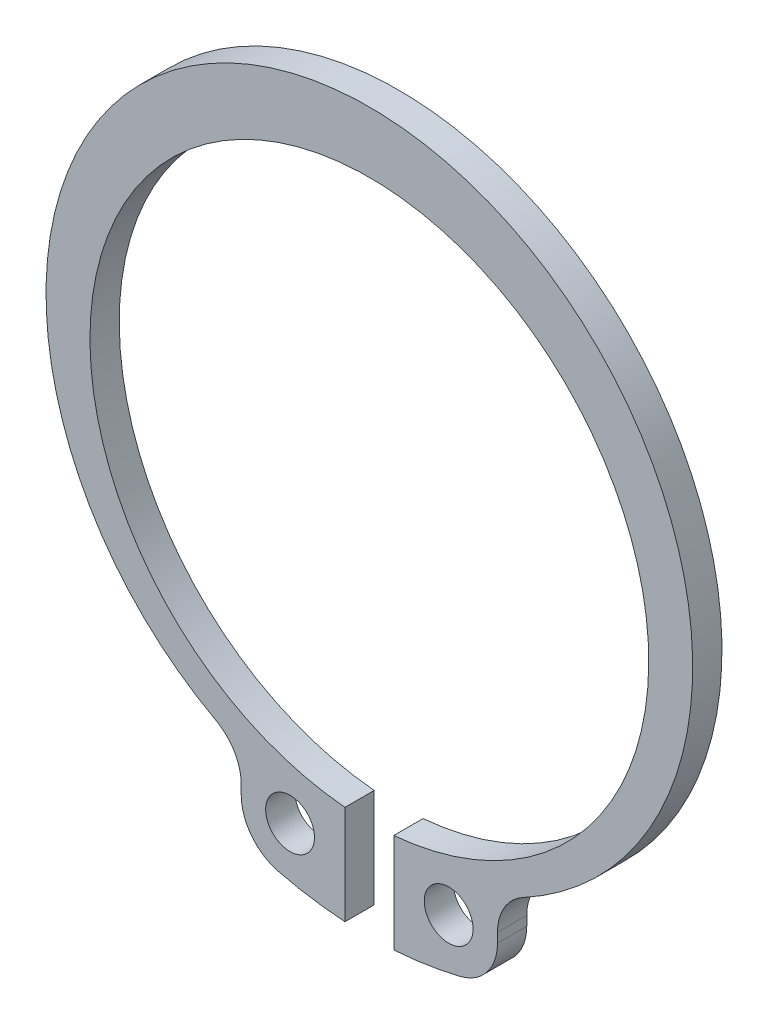
ISO-10303-21;
HEADER;
FILE_DESCRIPTION(('STEP AP214'),'2;1');
FILE_NAME('part.step','',(''),(''),'','','');
FILE_SCHEMA(('AUTOMOTIVE_DESIGN { 1 0 10303 214 1 1 1 1 }'));
ENDSEC;
DATA;
#1=APPLICATION_CONTEXT('core data for automotive mechanical design processes');
#2=APPLICATION_PROTOCOL_DEFINITION('international standard','automotive_design',2000,#1);
#3=PRODUCT_CONTEXT('',#1,'mechanical');
#4=PRODUCT('Part','Part','',(#3));
#5=PRODUCT_RELATED_PRODUCT_CATEGORY('part','',(#4));
#6=PRODUCT_DEFINITION_FORMATION('','',#4);
#7=PRODUCT_DEFINITION_CONTEXT('part definition',#1,'design');
#8=PRODUCT_DEFINITION('design','',#6,#7);
#9=PRODUCT_DEFINITION_SHAPE('','',#8);
#10=(LENGTH_UNIT() NAMED_UNIT(*) SI_UNIT(.MILLI.,.METRE.));
#11=(NAMED_UNIT(*) PLANE_ANGLE_UNIT() SI_UNIT($,.RADIAN.));
#12=(NAMED_UNIT(*) SI_UNIT($,.STERADIAN.) SOLID_ANGLE_UNIT());
#13=UNCERTAINTY_MEASURE_WITH_UNIT(LENGTH_MEASURE(1.E-05),#10,'distance_accuracy_value','');
#14=(GEOMETRIC_REPRESENTATION_CONTEXT(3) GLOBAL_UNCERTAINTY_ASSIGNED_CONTEXT((#13)) GLOBAL_UNIT_ASSIGNED_CONTEXT((#10,
#11,#12)) REPRESENTATION_CONTEXT('',''));
#15=CARTESIAN_POINT('',(0.,0.,0.));
#16=DIRECTION('',(0.,0.,1.));
#17=DIRECTION('',(1.,0.,0.));
#18=AXIS2_PLACEMENT_3D('',#15,#16,#17);
#19=CARTESIAN_POINT('',(3.25,-13.1029576813786,1.2));
#20=DIRECTION('',(0.,0.,1.));
#21=DIRECTION('',(1.,0.,0.));
#22=AXIS2_PLACEMENT_3D('',#19,#20,#21);
#23=PLANE('',#22);
#24=CARTESIAN_POINT('',(3.25,-13.1029576813786,1.2));
#25=DIRECTION('',(0.,0.,1.));
#26=DIRECTION('',(1.,0.,0.));
#27=AXIS2_PLACEMENT_3D('',#24,#25,#26);
#28=CIRCLE('',#27,1.);
#29=CARTESIAN_POINT('',(4.25,-13.1029576813786,1.2));
#30=VERTEX_POINT('',#29);
#31=EDGE_CURVE('E136',#30,#30,#28,.T.);
#32=ORIENTED_EDGE('',*,*,#31,.F.);
#33=EDGE_LOOP('',(#32));
#34=FACE_BOUND('',#33,.T.);
#35=CARTESIAN_POINT('',(3.25,-13.1029576813786,1.2));
#36=DIRECTION('',(0.,0.,1.));
#37=DIRECTION('',(1.,0.,0.));
#38=AXIS2_PLACEMENT_3D('',#35,#36,#37);
#39=CIRCLE('',#38,2.);
#40=CARTESIAN_POINT('',(3.73148148148147,-15.0441365971383,1.2));
#41=VERTEX_POINT('',#40);
#42=CARTESIAN_POINT('',(5.25,-13.1029576813785,1.2));
#43=VERTEX_POINT('',#42);
#44=EDGE_CURVE('E170',#41,#43,#39,.T.);
#45=ORIENTED_EDGE('',*,*,#44,.T.);
#46=DIRECTION('',(0.,-1.,0.));
#47=VECTOR('',#46,1.);
#48=CARTESIAN_POINT('',(5.25,-12.7164078649986,1.2));
#49=LINE('',#48,#47);
#50=CARTESIAN_POINT('',(5.25,-12.7164078649986,1.2));
#51=VERTEX_POINT('',#50);
#52=EDGE_CURVE('E127',#51,#43,#49,.T.);
#53=ORIENTED_EDGE('',*,*,#52,.F.);
#54=CARTESIAN_POINT('',(7.25000000000001,-12.7164078649987,1.2));
#55=DIRECTION('',(0.,0.,1.));
#56=DIRECTION('',(1.,0.,0.));
#57=AXIS2_PLACEMENT_3D('',#54,#55,#56);
#58=CIRCLE('',#57,2.);
#59=CARTESIAN_POINT('',(6.29918032786886,-10.956878964671,1.2));
#60=VERTEX_POINT('',#59);
#61=EDGE_CURVE('E173',#60,#51,#58,.T.);
#62=ORIENTED_EDGE('',*,*,#61,.F.);
#63=CARTESIAN_POINT('',(0.,0.699999999999978,1.2));
#64=DIRECTION('',(0.,0.,1.));
#65=DIRECTION('',(1.,0.,0.));
#66=AXIS2_PLACEMENT_3D('',#63,#64,#65);
#67=CIRCLE('',#66,13.25);
#68=CARTESIAN_POINT('',(-6.29918032786884,-10.9568789646708,1.2));
#69=VERTEX_POINT('',#68);
#70=EDGE_CURVE('E176',#60,#69,#67,.T.);
#71=ORIENTED_EDGE('',*,*,#70,.T.);
#72=CARTESIAN_POINT('',(-7.24999999999999,-12.7164078649986,1.2));
#73=DIRECTION('',(0.,0.,-1.));
#74=DIRECTION('',(-1.,0.,0.));
#75=AXIS2_PLACEMENT_3D('',#72,#73,#74);
#76=CIRCLE('',#75,2.);
#77=CARTESIAN_POINT('',(-5.24999999999999,-12.7164078649987,1.2));
#78=VERTEX_POINT('',#77);
#79=EDGE_CURVE('E178',#69,#78,#76,.T.);
#80=ORIENTED_EDGE('',*,*,#79,.T.);
#81=DIRECTION('',(0.,-1.,0.));
#82=VECTOR('',#81,1.);
#83=CARTESIAN_POINT('',(-5.24999999999999,-12.7164078649987,1.2));
#84=LINE('',#83,#82);
#85=CARTESIAN_POINT('',(-5.24999999999999,-13.1029576813786,1.2));
#86=VERTEX_POINT('',#85);
#87=EDGE_CURVE('E180',#78,#86,#84,.T.);
#88=ORIENTED_EDGE('',*,*,#87,.T.);
#89=CARTESIAN_POINT('',(-3.25,-13.1029576813785,1.2));
#90=DIRECTION('',(0.,0.,-1.));
#91=DIRECTION('',(-1.,0.,0.));
#92=AXIS2_PLACEMENT_3D('',#89,#90,#91);
#93=CIRCLE('',#92,2.);
#94=CARTESIAN_POINT('',(-3.73148148148149,-15.0441365971384,1.2));
#95=VERTEX_POINT('',#94);
#96=EDGE_CURVE('E182',#95,#86,#93,.T.);
#97=ORIENTED_EDGE('',*,*,#96,.F.);
#98=CARTESIAN_POINT('',(0.,0.,1.2));
#99=DIRECTION('',(0.,0.,1.));
#100=DIRECTION('',(1.,0.,0.));
#101=AXIS2_PLACEMENT_3D('',#98,#99,#100);
#102=CIRCLE('',#101,15.5);
#103=CARTESIAN_POINT('',(-1.,-15.4677082982579,1.2));
#104=VERTEX_POINT('',#103);
#105=EDGE_CURVE('E185',#95,#104,#102,.T.);
#106=ORIENTED_EDGE('',*,*,#105,.T.);
#107=DIRECTION('',(0.,-1.,0.));
#108=VECTOR('',#107,1.);
#109=CARTESIAN_POINT('',(-1.,-11.4062482876709,1.2));
#110=LINE('',#109,#108);
#111=CARTESIAN_POINT('',(-0.999999999999987,-11.4062482876709,1.2));
#112=VERTEX_POINT('',#111);
#113=EDGE_CURVE('E187',#112,#104,#110,.T.);
#114=ORIENTED_EDGE('',*,*,#113,.F.);
#115=CARTESIAN_POINT('',(0.,0.,1.2));
#116=DIRECTION('',(0.,0.,1.));
#117=DIRECTION('',(1.,0.,0.));
#118=AXIS2_PLACEMENT_3D('',#115,#116,#117);
#119=CIRCLE('',#118,11.45);
#120=CARTESIAN_POINT('',(1.,-11.4062482876711,1.2));
#121=VERTEX_POINT('',#120);
#122=EDGE_CURVE('E190',#121,#112,#119,.T.);
#123=ORIENTED_EDGE('',*,*,#122,.F.);
#124=DIRECTION('',(0.,-1.,0.));
#125=VECTOR('',#124,1.);
#126=CARTESIAN_POINT('',(1.,-11.4062482876711,1.2));
#127=LINE('',#126,#125);
#128=CARTESIAN_POINT('',(1.,-15.467708298258,1.2));
#129=VERTEX_POINT('',#128);
#130=EDGE_CURVE('E52',#121,#129,#127,.T.);
#131=ORIENTED_EDGE('',*,*,#130,.T.);
#132=CARTESIAN_POINT('',(0.,0.,1.2));
#133=DIRECTION('',(0.,0.,1.));
#134=DIRECTION('',(1.,0.,0.));
#135=AXIS2_PLACEMENT_3D('',#132,#133,#134);
#136=CIRCLE('',#135,15.5);
#137=EDGE_CURVE('E47',#129,#41,#136,.T.);
#138=ORIENTED_EDGE('',*,*,#137,.T.);
#139=EDGE_LOOP('',(#45,#53,#62,#71,#80,#88,#97,#106,#114,#123,#131,#138));
#140=FACE_BOUND('',#139,.T.);
#141=CARTESIAN_POINT('',(-3.25,-13.1029576813785,1.2));
#142=DIRECTION('',(0.,0.,1.));
#143=DIRECTION('',(1.,0.,0.));
#144=AXIS2_PLACEMENT_3D('',#141,#142,#143);
#145=CIRCLE('',#144,1.);
#146=CARTESIAN_POINT('',(-2.25,-13.1029576813785,1.2));
#147=VERTEX_POINT('',#146);
#148=EDGE_CURVE('E283',#147,#147,#145,.T.);
#149=ORIENTED_EDGE('',*,*,#148,.F.);
#150=EDGE_LOOP('',(#149));
#151=FACE_BOUND('',#150,.T.);
#152=ADVANCED_FACE('F32',(#34,#140,#151),#23,.T.);
#153=CARTESIAN_POINT('',(3.25,-13.1029576813786,0.));
#154=DIRECTION('',(0.,0.,1.));
#155=DIRECTION('',(1.,0.,0.));
#156=AXIS2_PLACEMENT_3D('',#153,#154,#155);
#157=PLANE('',#156);
#158=CARTESIAN_POINT('',(3.25,-13.1029576813786,0.));
#159=DIRECTION('',(0.,0.,1.));
#160=DIRECTION('',(1.,0.,0.));
#161=AXIS2_PLACEMENT_3D('',#158,#159,#160);
#162=CIRCLE('',#161,1.);
#163=CARTESIAN_POINT('',(4.25,-13.1029576813786,0.));
#164=VERTEX_POINT('',#163);
#165=EDGE_CURVE('E288',#164,#164,#162,.T.);
#166=ORIENTED_EDGE('',*,*,#165,.T.);
#167=EDGE_LOOP('',(#166));
#168=FACE_BOUND('',#167,.T.);
#169=CARTESIAN_POINT('',(3.25,-13.1029576813786,0.));
#170=DIRECTION('',(0.,0.,1.));
#171=DIRECTION('',(1.,0.,0.));
#172=AXIS2_PLACEMENT_3D('',#169,#170,#171);
#173=CIRCLE('',#172,2.);
#174=CARTESIAN_POINT('',(3.73148148148147,-15.0441365971383,0.));
#175=VERTEX_POINT('',#174);
#176=CARTESIAN_POINT('',(5.25,-13.1029576813785,0.));
#177=VERTEX_POINT('',#176);
#178=EDGE_CURVE('E132',#175,#177,#173,.T.);
#179=ORIENTED_EDGE('',*,*,#178,.F.);
#180=CARTESIAN_POINT('',(0.,0.,0.));
#181=DIRECTION('',(0.,0.,1.));
#182=DIRECTION('',(1.,0.,0.));
#183=AXIS2_PLACEMENT_3D('',#180,#181,#182);
#184=CIRCLE('',#183,15.5);
#185=CARTESIAN_POINT('',(1.,-15.467708298258,0.));
#186=VERTEX_POINT('',#185);
#187=EDGE_CURVE('E168',#186,#175,#184,.T.);
#188=ORIENTED_EDGE('',*,*,#187,.F.);
#189=DIRECTION('',(0.,-1.,0.));
#190=VECTOR('',#189,1.);
#191=CARTESIAN_POINT('',(1.,-11.4062482876711,0.));
#192=LINE('',#191,#190);
#193=CARTESIAN_POINT('',(1.,-11.4062482876711,0.));
#194=VERTEX_POINT('',#193);
#195=EDGE_CURVE('E166',#194,#186,#192,.T.);
#196=ORIENTED_EDGE('',*,*,#195,.F.);
#197=CARTESIAN_POINT('',(0.,0.,0.));
#198=DIRECTION('',(0.,0.,1.));
#199=DIRECTION('',(1.,0.,0.));
#200=AXIS2_PLACEMENT_3D('',#197,#198,#199);
#201=CIRCLE('',#200,11.45);
#202=CARTESIAN_POINT('',(-0.999999999999987,-11.4062482876709,0.));
#203=VERTEX_POINT('',#202);
#204=EDGE_CURVE('E163',#194,#203,#201,.T.);
#205=ORIENTED_EDGE('',*,*,#204,.T.);
#206=DIRECTION('',(0.,-1.,0.));
#207=VECTOR('',#206,1.);
#208=CARTESIAN_POINT('',(-1.,-11.4062482876709,0.));
#209=LINE('',#208,#207);
#210=CARTESIAN_POINT('',(-1.,-15.4677082982579,0.));
#211=VERTEX_POINT('',#210);
#212=EDGE_CURVE('E160',#203,#211,#209,.T.);
#213=ORIENTED_EDGE('',*,*,#212,.T.);
#214=CARTESIAN_POINT('',(0.,0.,0.));
#215=DIRECTION('',(0.,0.,1.));
#216=DIRECTION('',(1.,0.,0.));
#217=AXIS2_PLACEMENT_3D('',#214,#215,#216);
#218=CIRCLE('',#217,15.5);
#219=CARTESIAN_POINT('',(-3.73148148148149,-15.0441365971384,0.));
#220=VERTEX_POINT('',#219);
#221=EDGE_CURVE('E157',#220,#211,#218,.T.);
#222=ORIENTED_EDGE('',*,*,#221,.F.);
#223=CARTESIAN_POINT('',(-3.25,-13.1029576813785,0.));
#224=DIRECTION('',(0.,0.,-1.));
#225=DIRECTION('',(-1.,0.,0.));
#226=AXIS2_PLACEMENT_3D('',#223,#224,#225);
#227=CIRCLE('',#226,2.);
#228=CARTESIAN_POINT('',(-5.24999999999999,-13.1029576813786,0.));
#229=VERTEX_POINT('',#228);
#230=EDGE_CURVE('E154',#220,#229,#227,.T.);
#231=ORIENTED_EDGE('',*,*,#230,.T.);
#232=DIRECTION('',(0.,-1.,0.));
#233=VECTOR('',#232,1.);
#234=CARTESIAN_POINT('',(-5.24999999999999,-12.7164078649987,0.));
#235=LINE('',#234,#233);
#236=CARTESIAN_POINT('',(-5.24999999999999,-12.7164078649987,0.));
#237=VERTEX_POINT('',#236);
#238=EDGE_CURVE('E151',#237,#229,#235,.T.);
#239=ORIENTED_EDGE('',*,*,#238,.F.);
#240=CARTESIAN_POINT('',(-7.24999999999999,-12.7164078649986,0.));
#241=DIRECTION('',(0.,0.,-1.));
#242=DIRECTION('',(-1.,0.,0.));
#243=AXIS2_PLACEMENT_3D('',#240,#241,#242);
#244=CIRCLE('',#243,2.);
#245=CARTESIAN_POINT('',(-6.29918032786884,-10.9568789646708,0.));
#246=VERTEX_POINT('',#245);
#247=EDGE_CURVE('E149',#246,#237,#244,.T.);
#248=ORIENTED_EDGE('',*,*,#247,.F.);
#249=CARTESIAN_POINT('',(0.,0.699999999999978,0.));
#250=DIRECTION('',(0.,0.,1.));
#251=DIRECTION('',(1.,0.,0.));
#252=AXIS2_PLACEMENT_3D('',#249,#250,#251);
#253=CIRCLE('',#252,13.25);
#254=CARTESIAN_POINT('',(6.29918032786886,-10.956878964671,0.));
#255=VERTEX_POINT('',#254);
#256=EDGE_CURVE('E144',#255,#246,#253,.T.);
#257=ORIENTED_EDGE('',*,*,#256,.F.);
#258=CARTESIAN_POINT('',(7.25000000000001,-12.7164078649987,0.));
#259=DIRECTION('',(0.,0.,1.));
#260=DIRECTION('',(1.,0.,0.));
#261=AXIS2_PLACEMENT_3D('',#258,#259,#260);
#262=CIRCLE('',#261,2.);
#263=CARTESIAN_POINT('',(5.25,-12.7164078649986,0.));
#264=VERTEX_POINT('',#263);
#265=EDGE_CURVE('E142',#255,#264,#262,.T.);
#266=ORIENTED_EDGE('',*,*,#265,.T.);
#267=DIRECTION('',(0.,-1.,0.));
#268=VECTOR('',#267,1.);
#269=CARTESIAN_POINT('',(5.25,-12.7164078649986,0.));
#270=LINE('',#269,#268);
#271=EDGE_CURVE('E124',#264,#177,#270,.T.);
#272=ORIENTED_EDGE('',*,*,#271,.T.);
#273=EDGE_LOOP('',(#179,#188,#196,#205,#213,#222,#231,#239,#248,#257,#266,#272));
#274=FACE_BOUND('',#273,.T.);
#275=CARTESIAN_POINT('',(-3.25,-13.1029576813785,0.));
#276=DIRECTION('',(0.,0.,1.));
#277=DIRECTION('',(1.,0.,0.));
#278=AXIS2_PLACEMENT_3D('',#275,#276,#277);
#279=CIRCLE('',#278,1.);
#280=CARTESIAN_POINT('',(-2.25,-13.1029576813785,0.));
#281=VERTEX_POINT('',#280);
#282=EDGE_CURVE('E286',#281,#281,#279,.T.);
#283=ORIENTED_EDGE('',*,*,#282,.T.);
#284=EDGE_LOOP('',(#283));
#285=FACE_BOUND('',#284,.T.);
#286=ADVANCED_FACE('F138',(#168,#274,#285),#157,.F.);
#287=CARTESIAN_POINT('',(3.25,-13.1029576813786,1.2));
#288=DIRECTION('',(0.,0.,-1.));
#289=DIRECTION('',(-1.,0.,0.));
#290=AXIS2_PLACEMENT_3D('',#287,#288,#289);
#291=CYLINDRICAL_SURFACE('',#290,2.);
#292=ORIENTED_EDGE('',*,*,#178,.T.);
#293=DIRECTION('',(0.,0.,-1.));
#294=VECTOR('',#293,1.);
#295=CARTESIAN_POINT('',(5.25,-13.1029576813785,1.2));
#296=LINE('',#295,#294);
#297=EDGE_CURVE('E11',#43,#177,#296,.T.);
#298=ORIENTED_EDGE('',*,*,#297,.F.);
#299=ORIENTED_EDGE('',*,*,#44,.F.);
#300=DIRECTION('',(0.,0.,-1.));
#301=VECTOR('',#300,1.);
#302=CARTESIAN_POINT('',(3.73148148148147,-15.0441365971383,1.2));
#303=LINE('',#302,#301);
#304=EDGE_CURVE('E133',#41,#175,#303,.T.);
#305=ORIENTED_EDGE('',*,*,#304,.T.);
#306=EDGE_LOOP('',(#292,#298,#299,#305));
#307=FACE_BOUND('',#306,.T.);
#308=ADVANCED_FACE('F34',(#307),#291,.T.);
#309=CARTESIAN_POINT('',(5.25,-12.7164078649986,1.2));
#310=DIRECTION('',(1.,0.,0.));
#311=DIRECTION('',(0.,0.,-1.));
#312=AXIS2_PLACEMENT_3D('',#309,#310,#311);
#313=PLANE('',#312);
#314=ORIENTED_EDGE('',*,*,#271,.F.);
#315=DIRECTION('',(0.,0.,-1.));
#316=VECTOR('',#315,1.);
#317=CARTESIAN_POINT('',(5.25,-12.7164078649986,1.2));
#318=LINE('',#317,#316);
#319=EDGE_CURVE('E40',#51,#264,#318,.T.);
#320=ORIENTED_EDGE('',*,*,#319,.F.);
#321=ORIENTED_EDGE('',*,*,#52,.T.);
#322=ORIENTED_EDGE('',*,*,#297,.T.);
#323=EDGE_LOOP('',(#314,#320,#321,#322));
#324=FACE_BOUND('',#323,.T.);
#325=ADVANCED_FACE('F122',(#324),#313,.T.);
#326=CARTESIAN_POINT('',(7.25000000000001,-12.7164078649987,1.2));
#327=DIRECTION('',(0.,0.,-1.));
#328=DIRECTION('',(-1.,0.,0.));
#329=AXIS2_PLACEMENT_3D('',#326,#327,#328);
#330=CYLINDRICAL_SURFACE('',#329,2.);
#331=ORIENTED_EDGE('',*,*,#265,.F.);
#332=DIRECTION('',(0.,0.,-1.));
#333=VECTOR('',#332,1.);
#334=CARTESIAN_POINT('',(6.29918032786886,-10.956878964671,1.2));
#335=LINE('',#334,#333);
#336=EDGE_CURVE('E215',#60,#255,#335,.T.);
#337=ORIENTED_EDGE('',*,*,#336,.F.);
#338=ORIENTED_EDGE('',*,*,#61,.T.);
#339=ORIENTED_EDGE('',*,*,#319,.T.);
#340=EDGE_LOOP('',(#331,#337,#338,#339));
#341=FACE_BOUND('',#340,.T.);
#342=ADVANCED_FACE('F217',(#341),#330,.F.);
#343=CARTESIAN_POINT('',(0.,0.699999999999978,1.2));
#344=DIRECTION('',(0.,0.,-1.));
#345=DIRECTION('',(-1.,0.,0.));
#346=AXIS2_PLACEMENT_3D('',#343,#344,#345);
#347=CYLINDRICAL_SURFACE('',#346,13.25);
#348=ORIENTED_EDGE('',*,*,#256,.T.);
#349=DIRECTION('',(0.,0.,-1.));
#350=VECTOR('',#349,1.);
#351=CARTESIAN_POINT('',(-6.29918032786884,-10.9568789646708,1.2));
#352=LINE('',#351,#350);
#353=EDGE_CURVE('E212',#69,#246,#352,.T.);
#354=ORIENTED_EDGE('',*,*,#353,.F.);
#355=ORIENTED_EDGE('',*,*,#70,.F.);
#356=ORIENTED_EDGE('',*,*,#336,.T.);
#357=EDGE_LOOP('',(#348,#354,#355,#356));
#358=FACE_BOUND('',#357,.T.);
#359=ADVANCED_FACE('F225',(#358),#347,.T.);
#360=CARTESIAN_POINT('',(-7.24999999999999,-12.7164078649986,1.2));
#361=DIRECTION('',(0.,0.,-1.));
#362=DIRECTION('',(-1.,0.,0.));
#363=AXIS2_PLACEMENT_3D('',#360,#361,#362);
#364=CYLINDRICAL_SURFACE('',#363,2.);
#365=ORIENTED_EDGE('',*,*,#247,.T.);
#366=DIRECTION('',(0.,0.,-1.));
#367=VECTOR('',#366,1.);
#368=CARTESIAN_POINT('',(-5.24999999999999,-12.7164078649987,1.2));
#369=LINE('',#368,#367);
#370=EDGE_CURVE('E209',#78,#237,#369,.T.);
#371=ORIENTED_EDGE('',*,*,#370,.F.);
#372=ORIENTED_EDGE('',*,*,#79,.F.);
#373=ORIENTED_EDGE('',*,*,#353,.T.);
#374=EDGE_LOOP('',(#365,#371,#372,#373));
#375=FACE_BOUND('',#374,.T.);
#376=ADVANCED_FACE('F228',(#375),#364,.F.);
#377=CARTESIAN_POINT('',(-5.24999999999999,-12.7164078649987,1.2));
#378=DIRECTION('',(1.,0.,0.));
#379=DIRECTION('',(0.,0.,-1.));
#380=AXIS2_PLACEMENT_3D('',#377,#378,#379);
#381=PLANE('',#380);
#382=ORIENTED_EDGE('',*,*,#238,.T.);
#383=DIRECTION('',(0.,0.,-1.));
#384=VECTOR('',#383,1.);
#385=CARTESIAN_POINT('',(-5.24999999999999,-13.1029576813786,1.2));
#386=LINE('',#385,#384);
#387=EDGE_CURVE('E207',#86,#229,#386,.T.);
#388=ORIENTED_EDGE('',*,*,#387,.F.);
#389=ORIENTED_EDGE('',*,*,#87,.F.);
#390=ORIENTED_EDGE('',*,*,#370,.T.);
#391=EDGE_LOOP('',(#382,#388,#389,#390));
#392=FACE_BOUND('',#391,.T.);
#393=ADVANCED_FACE('F233',(#392),#381,.F.);
#394=CARTESIAN_POINT('',(-3.25,-13.1029576813785,1.2));
#395=DIRECTION('',(0.,0.,-1.));
#396=DIRECTION('',(-1.,0.,0.));
#397=AXIS2_PLACEMENT_3D('',#394,#395,#396);
#398=CYLINDRICAL_SURFACE('',#397,2.);
#399=ORIENTED_EDGE('',*,*,#230,.F.);
#400=DIRECTION('',(0.,0.,-1.));
#401=VECTOR('',#400,1.);
#402=CARTESIAN_POINT('',(-3.73148148148149,-15.0441365971384,1.2));
#403=LINE('',#402,#401);
#404=EDGE_CURVE('E205',#95,#220,#403,.T.);
#405=ORIENTED_EDGE('',*,*,#404,.F.);
#406=ORIENTED_EDGE('',*,*,#96,.T.);
#407=ORIENTED_EDGE('',*,*,#387,.T.);
#408=EDGE_LOOP('',(#399,#405,#406,#407));
#409=FACE_BOUND('',#408,.T.);
#410=ADVANCED_FACE('F240',(#409),#398,.T.);
#411=CARTESIAN_POINT('',(0.,0.,1.2));
#412=DIRECTION('',(0.,0.,-1.));
#413=DIRECTION('',(-1.,0.,0.));
#414=AXIS2_PLACEMENT_3D('',#411,#412,#413);
#415=CYLINDRICAL_SURFACE('',#414,15.5);
#416=ORIENTED_EDGE('',*,*,#221,.T.);
#417=DIRECTION('',(0.,0.,-1.));
#418=VECTOR('',#417,1.);
#419=CARTESIAN_POINT('',(-1.,-15.4677082982579,1.2));
#420=LINE('',#419,#418);
#421=EDGE_CURVE('E203',#104,#211,#420,.T.);
#422=ORIENTED_EDGE('',*,*,#421,.F.);
#423=ORIENTED_EDGE('',*,*,#105,.F.);
#424=ORIENTED_EDGE('',*,*,#404,.T.);
#425=EDGE_LOOP('',(#416,#422,#423,#424));
#426=FACE_BOUND('',#425,.T.);
#427=ADVANCED_FACE('F243',(#426),#415,.T.);
#428=CARTESIAN_POINT('',(-1.,-11.4062482876709,1.2));
#429=DIRECTION('',(1.,0.,0.));
#430=DIRECTION('',(0.,0.,-1.));
#431=AXIS2_PLACEMENT_3D('',#428,#429,#430);
#432=PLANE('',#431);
#433=ORIENTED_EDGE('',*,*,#212,.F.);
#434=DIRECTION('',(0.,0.,-1.));
#435=VECTOR('',#434,1.);
#436=CARTESIAN_POINT('',(-0.999999999999987,-11.4062482876709,1.2));
#437=LINE('',#436,#435);
#438=EDGE_CURVE('E201',#112,#203,#437,.T.);
#439=ORIENTED_EDGE('',*,*,#438,.F.);
#440=ORIENTED_EDGE('',*,*,#113,.T.);
#441=ORIENTED_EDGE('',*,*,#421,.T.);
#442=EDGE_LOOP('',(#433,#439,#440,#441));
#443=FACE_BOUND('',#442,.T.);
#444=ADVANCED_FACE('F246',(#443),#432,.T.);
#445=CARTESIAN_POINT('',(0.,0.,1.2));
#446=DIRECTION('',(0.,0.,-1.));
#447=DIRECTION('',(-1.,0.,0.));
#448=AXIS2_PLACEMENT_3D('',#445,#446,#447);
#449=CYLINDRICAL_SURFACE('',#448,11.45);
#450=ORIENTED_EDGE('',*,*,#204,.F.);
#451=DIRECTION('',(0.,0.,-1.));
#452=VECTOR('',#451,1.);
#453=CARTESIAN_POINT('',(1.,-11.4062482876711,1.2));
#454=LINE('',#453,#452);
#455=EDGE_CURVE('E199',#121,#194,#454,.T.);
#456=ORIENTED_EDGE('',*,*,#455,.F.);
#457=ORIENTED_EDGE('',*,*,#122,.T.);
#458=ORIENTED_EDGE('',*,*,#438,.T.);
#459=EDGE_LOOP('',(#450,#456,#457,#458));
#460=FACE_BOUND('',#459,.T.);
#461=ADVANCED_FACE('F249',(#460),#449,.F.);
#462=CARTESIAN_POINT('',(1.,-11.4062482876711,1.2));
#463=DIRECTION('',(1.,0.,0.));
#464=DIRECTION('',(0.,0.,-1.));
#465=AXIS2_PLACEMENT_3D('',#462,#463,#464);
#466=PLANE('',#465);
#467=ORIENTED_EDGE('',*,*,#195,.T.);
#468=DIRECTION('',(0.,0.,-1.));
#469=VECTOR('',#468,1.);
#470=CARTESIAN_POINT('',(1.,-15.467708298258,1.2));
#471=LINE('',#470,#469);
#472=EDGE_CURVE('E196',#129,#186,#471,.T.);
#473=ORIENTED_EDGE('',*,*,#472,.F.);
#474=ORIENTED_EDGE('',*,*,#130,.F.);
#475=ORIENTED_EDGE('',*,*,#455,.T.);
#476=EDGE_LOOP('',(#467,#473,#474,#475));
#477=FACE_BOUND('',#476,.T.);
#478=ADVANCED_FACE('F252',(#477),#466,.F.);
#479=CARTESIAN_POINT('',(0.,0.,1.2));
#480=DIRECTION('',(0.,0.,-1.));
#481=DIRECTION('',(-1.,0.,0.));
#482=AXIS2_PLACEMENT_3D('',#479,#480,#481);
#483=CYLINDRICAL_SURFACE('',#482,15.5);
#484=ORIENTED_EDGE('',*,*,#187,.T.);
#485=ORIENTED_EDGE('',*,*,#304,.F.);
#486=ORIENTED_EDGE('',*,*,#137,.F.);
#487=ORIENTED_EDGE('',*,*,#472,.T.);
#488=EDGE_LOOP('',(#484,#485,#486,#487));
#489=FACE_BOUND('',#488,.T.);
#490=ADVANCED_FACE('F254',(#489),#483,.T.);
#491=CARTESIAN_POINT('',(3.25,-13.1029576813786,1.2));
#492=DIRECTION('',(0.,0.,-1.));
#493=DIRECTION('',(-1.,0.,0.));
#494=AXIS2_PLACEMENT_3D('',#491,#492,#493);
#495=CYLINDRICAL_SURFACE('',#494,1.);
#496=ORIENTED_EDGE('',*,*,#31,.T.);
#497=EDGE_LOOP('',(#496));
#498=FACE_BOUND('',#497,.T.);
#499=ORIENTED_EDGE('',*,*,#165,.F.);
#500=EDGE_LOOP('',(#499));
#501=FACE_BOUND('',#500,.T.);
#502=ADVANCED_FACE('F256',(#498,#501),#495,.F.);
#503=CARTESIAN_POINT('',(-3.25,-13.1029576813785,1.2));
#504=DIRECTION('',(0.,0.,-1.));
#505=DIRECTION('',(-1.,0.,0.));
#506=AXIS2_PLACEMENT_3D('',#503,#504,#505);
#507=CYLINDRICAL_SURFACE('',#506,1.);
#508=ORIENTED_EDGE('',*,*,#148,.T.);
#509=EDGE_LOOP('',(#508));
#510=FACE_BOUND('',#509,.T.);
#511=ORIENTED_EDGE('',*,*,#282,.F.);
#512=EDGE_LOOP('',(#511));
#513=FACE_BOUND('',#512,.T.);
#514=ADVANCED_FACE('F262',(#510,#513),#507,.F.);
#515=CLOSED_SHELL('',(#152,#286,#308,#325,#342,#359,#376,#393,#410,#427,#444,#461,#478,#490,
#502,#514));
#516=MANIFOLD_SOLID_BREP('B2',#515);
#517=ADVANCED_BREP_SHAPE_REPRESENTATION('',(#18,#516),#14);
#518=SHAPE_DEFINITION_REPRESENTATION(#9,#517);
ENDSEC;
END-ISO-10303-21;
